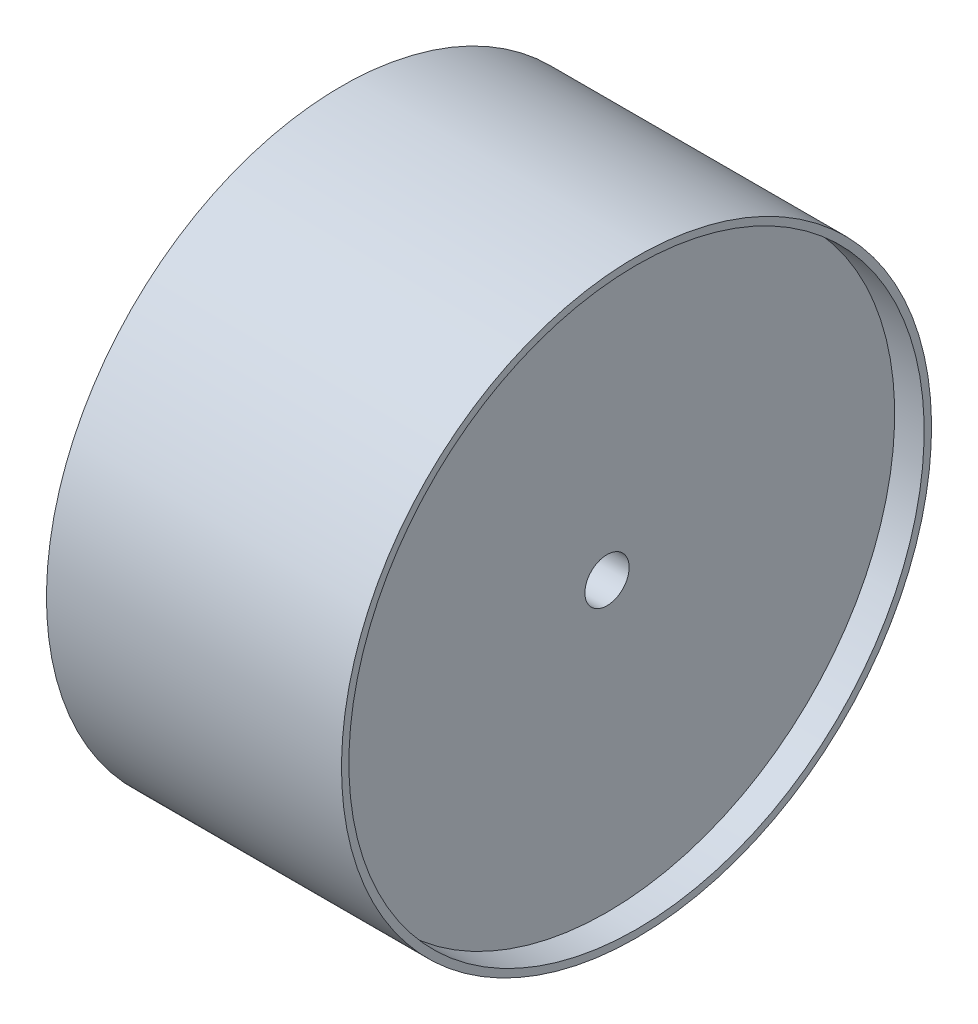
ISO-10303-21;
HEADER;
FILE_DESCRIPTION(('STEP AP214'),'2;1');
FILE_NAME('part.step','',(''),(''),'','','');
FILE_SCHEMA(('AUTOMOTIVE_DESIGN { 1 0 10303 214 1 1 1 1 }'));
ENDSEC;
DATA;
#1=APPLICATION_CONTEXT('core data for automotive mechanical design processes');
#2=APPLICATION_PROTOCOL_DEFINITION('international standard','automotive_design',2000,#1);
#3=PRODUCT_CONTEXT('',#1,'mechanical');
#4=PRODUCT('Part','Part','',(#3));
#5=PRODUCT_RELATED_PRODUCT_CATEGORY('part','',(#4));
#6=PRODUCT_DEFINITION_FORMATION('','',#4);
#7=PRODUCT_DEFINITION_CONTEXT('part definition',#1,'design');
#8=PRODUCT_DEFINITION('design','',#6,#7);
#9=PRODUCT_DEFINITION_SHAPE('','',#8);
#10=(LENGTH_UNIT() NAMED_UNIT(*) SI_UNIT(.MILLI.,.METRE.));
#11=(NAMED_UNIT(*) PLANE_ANGLE_UNIT() SI_UNIT($,.RADIAN.));
#12=(NAMED_UNIT(*) SI_UNIT($,.STERADIAN.) SOLID_ANGLE_UNIT());
#13=UNCERTAINTY_MEASURE_WITH_UNIT(LENGTH_MEASURE(1.E-05),#10,'distance_accuracy_value','');
#14=(GEOMETRIC_REPRESENTATION_CONTEXT(3) GLOBAL_UNCERTAINTY_ASSIGNED_CONTEXT((#13)) GLOBAL_UNIT_ASSIGNED_CONTEXT((#10,
#11,#12)) REPRESENTATION_CONTEXT('',''));
#15=CARTESIAN_POINT('',(0.,0.,0.));
#16=DIRECTION('',(0.,0.,1.));
#17=DIRECTION('',(1.,0.,0.));
#18=AXIS2_PLACEMENT_3D('',#15,#16,#17);
#19=CARTESIAN_POINT('',(40.,80.,0.));
#20=DIRECTION('',(-1.,0.,0.));
#21=DIRECTION('',(0.,-1.,0.));
#22=AXIS2_PLACEMENT_3D('',#19,#20,#21);
#23=PLANE('',#22);
#24=CARTESIAN_POINT('',(40.,-1.11022302462516E-13,-1.11022302462516E-13));
#25=DIRECTION('',(-1.,0.,0.));
#26=DIRECTION('',(0.,-1.,0.));
#27=AXIS2_PLACEMENT_3D('',#24,#25,#26);
#28=CIRCLE('',#27,80.);
#29=CARTESIAN_POINT('',(40.,-80.0000000000001,-1.15463194561016E-13));
#30=VERTEX_POINT('',#29);
#31=EDGE_CURVE('E87',#30,#30,#28,.T.);
#32=ORIENTED_EDGE('',*,*,#31,.F.);
#33=EDGE_LOOP('',(#32));
#34=FACE_BOUND('',#33,.T.);
#35=CARTESIAN_POINT('',(40.,-1.11022302462516E-13,-1.11022302462516E-13));
#36=DIRECTION('',(-1.,0.,0.));
#37=DIRECTION('',(0.,-1.,0.));
#38=AXIS2_PLACEMENT_3D('',#35,#36,#37);
#39=CIRCLE('',#38,78.);
#40=CARTESIAN_POINT('',(40.,-78.0000000000001,-1.15352172258554E-13));
#41=VERTEX_POINT('',#40);
#42=EDGE_CURVE('E66',#41,#41,#39,.T.);
#43=ORIENTED_EDGE('',*,*,#42,.T.);
#44=EDGE_LOOP('',(#43));
#45=FACE_BOUND('',#44,.T.);
#46=ADVANCED_FACE('F46',(#34,#45),#23,.F.);
#47=CARTESIAN_POINT('',(-118.179588976027,0.,0.));
#48=DIRECTION('',(-1.,0.,0.));
#49=DIRECTION('',(0.,-1.,0.));
#50=AXIS2_PLACEMENT_3D('',#47,#48,#49);
#51=CYLINDRICAL_SURFACE('',#50,78.);
#52=ORIENTED_EDGE('',*,*,#42,.F.);
#53=EDGE_LOOP('',(#52));
#54=FACE_BOUND('',#53,.T.);
#55=CARTESIAN_POINT('',(32.,-1.11022302462516E-13,-1.11022302462516E-13));
#56=DIRECTION('',(-1.,0.,0.));
#57=DIRECTION('',(0.,-1.,0.));
#58=AXIS2_PLACEMENT_3D('',#55,#56,#57);
#59=CIRCLE('',#58,78.);
#60=CARTESIAN_POINT('',(32.,-78.0000000000001,-1.15352172258554E-13));
#61=VERTEX_POINT('',#60);
#62=EDGE_CURVE('E69',#61,#61,#59,.T.);
#63=ORIENTED_EDGE('',*,*,#62,.T.);
#64=EDGE_LOOP('',(#63));
#65=FACE_BOUND('',#64,.T.);
#66=ADVANCED_FACE('F116',(#54,#65),#51,.F.);
#67=CARTESIAN_POINT('',(32.,77.9999999999998,-1.38777878078145E-13));
#68=DIRECTION('',(-1.,0.,0.));
#69=DIRECTION('',(0.,-1.,0.));
#70=AXIS2_PLACEMENT_3D('',#67,#68,#69);
#71=PLANE('',#70);
#72=ORIENTED_EDGE('',*,*,#62,.F.);
#73=EDGE_LOOP('',(#72));
#74=FACE_BOUND('',#73,.T.);
#75=CARTESIAN_POINT('',(32.,-1.11022302462516E-13,-1.11022302462516E-13));
#76=DIRECTION('',(-1.,0.,0.));
#77=DIRECTION('',(0.,-1.,0.));
#78=AXIS2_PLACEMENT_3D('',#75,#76,#77);
#79=CIRCLE('',#78,6.);
#80=CARTESIAN_POINT('',(32.,-6.00000000000011,-1.11355369369903E-13));
#81=VERTEX_POINT('',#80);
#82=EDGE_CURVE('E72',#81,#81,#79,.T.);
#83=ORIENTED_EDGE('',*,*,#82,.T.);
#84=EDGE_LOOP('',(#83));
#85=FACE_BOUND('',#84,.T.);
#86=ADVANCED_FACE('F122',(#74,#85),#71,.F.);
#87=CARTESIAN_POINT('',(-118.179588976027,0.,0.));
#88=DIRECTION('',(-1.,0.,0.));
#89=DIRECTION('',(0.,-1.,0.));
#90=AXIS2_PLACEMENT_3D('',#87,#88,#89);
#91=CYLINDRICAL_SURFACE('',#90,6.);
#92=ORIENTED_EDGE('',*,*,#82,.F.);
#93=EDGE_LOOP('',(#92));
#94=FACE_BOUND('',#93,.T.);
#95=CARTESIAN_POINT('',(-32.,-1.11022302462516E-13,0.));
#96=DIRECTION('',(-1.,0.,0.));
#97=DIRECTION('',(0.,-1.,0.));
#98=AXIS2_PLACEMENT_3D('',#95,#96,#97);
#99=CIRCLE('',#98,5.99999999999999);
#100=CARTESIAN_POINT('',(-32.,-6.0000000000001,0.));
#101=VERTEX_POINT('',#100);
#102=EDGE_CURVE('E75',#101,#101,#99,.T.);
#103=ORIENTED_EDGE('',*,*,#102,.T.);
#104=EDGE_LOOP('',(#103));
#105=FACE_BOUND('',#104,.T.);
#106=ADVANCED_FACE('F130',(#94,#105),#91,.F.);
#107=CARTESIAN_POINT('',(-32.,77.9999999999998,-1.11022302462516E-13));
#108=DIRECTION('',(1.,0.,0.));
#109=DIRECTION('',(0.,1.,0.));
#110=AXIS2_PLACEMENT_3D('',#107,#108,#109);
#111=PLANE('',#110);
#112=CARTESIAN_POINT('',(-32.,-49.9847883986185,-3.60822483003176E-13));
#113=DIRECTION('',(-1.,0.,0.));
#114=DIRECTION('',(0.,-1.,0.));
#115=AXIS2_PLACEMENT_3D('',#112,#113,#114);
#116=CIRCLE('',#115,7.5);
#117=CARTESIAN_POINT('',(-32.,-57.4847883986185,-3.6123881663741E-13));
#118=VERTEX_POINT('',#117);
#119=EDGE_CURVE('E90',#118,#118,#116,.T.);
#120=ORIENTED_EDGE('',*,*,#119,.F.);
#121=EDGE_LOOP('',(#120));
#122=FACE_BOUND('',#121,.T.);
#123=ORIENTED_EDGE('',*,*,#102,.F.);
#124=EDGE_LOOP('',(#123));
#125=FACE_BOUND('',#124,.T.);
#126=CARTESIAN_POINT('',(-32.,-1.11022302462516E-13,0.));
#127=DIRECTION('',(-1.,0.,0.));
#128=DIRECTION('',(0.,-1.,0.));
#129=AXIS2_PLACEMENT_3D('',#126,#127,#128);
#130=CIRCLE('',#129,78.);
#131=CARTESIAN_POINT('',(-32.,-78.0000000000001,0.));
#132=VERTEX_POINT('',#131);
#133=EDGE_CURVE('E78',#132,#132,#130,.T.);
#134=ORIENTED_EDGE('',*,*,#133,.T.);
#135=EDGE_LOOP('',(#134));
#136=FACE_BOUND('',#135,.T.);
#137=ADVANCED_FACE('F134',(#122,#125,#136),#111,.F.);
#138=CARTESIAN_POINT('',(-118.179588976027,0.,0.));
#139=DIRECTION('',(-1.,0.,0.));
#140=DIRECTION('',(0.,-1.,0.));
#141=AXIS2_PLACEMENT_3D('',#138,#139,#140);
#142=CYLINDRICAL_SURFACE('',#141,78.);
#143=ORIENTED_EDGE('',*,*,#133,.F.);
#144=EDGE_LOOP('',(#143));
#145=FACE_BOUND('',#144,.T.);
#146=CARTESIAN_POINT('',(-40.,-1.11022302462516E-13,0.));
#147=DIRECTION('',(-1.,0.,0.));
#148=DIRECTION('',(0.,-1.,0.));
#149=AXIS2_PLACEMENT_3D('',#146,#147,#148);
#150=CIRCLE('',#149,78.);
#151=CARTESIAN_POINT('',(-40.,-78.0000000000001,0.));
#152=VERTEX_POINT('',#151);
#153=EDGE_CURVE('E81',#152,#152,#150,.T.);
#154=ORIENTED_EDGE('',*,*,#153,.T.);
#155=EDGE_LOOP('',(#154));
#156=FACE_BOUND('',#155,.T.);
#157=ADVANCED_FACE('F138',(#145,#156),#142,.F.);
#158=CARTESIAN_POINT('',(-40.,80.,0.));
#159=DIRECTION('',(1.,0.,0.));
#160=DIRECTION('',(0.,1.,0.));
#161=AXIS2_PLACEMENT_3D('',#158,#159,#160);
#162=PLANE('',#161);
#163=ORIENTED_EDGE('',*,*,#153,.F.);
#164=EDGE_LOOP('',(#163));
#165=FACE_BOUND('',#164,.T.);
#166=CARTESIAN_POINT('',(-40.,-1.11022302462516E-13,0.));
#167=DIRECTION('',(-1.,0.,0.));
#168=DIRECTION('',(0.,-1.,0.));
#169=AXIS2_PLACEMENT_3D('',#166,#167,#168);
#170=CIRCLE('',#169,80.);
#171=CARTESIAN_POINT('',(-40.,-80.0000000000001,0.));
#172=VERTEX_POINT('',#171);
#173=EDGE_CURVE('E84',#172,#172,#170,.T.);
#174=ORIENTED_EDGE('',*,*,#173,.T.);
#175=EDGE_LOOP('',(#174));
#176=FACE_BOUND('',#175,.T.);
#177=ADVANCED_FACE('F142',(#165,#176),#162,.F.);
#178=CARTESIAN_POINT('',(-118.179588976027,0.,0.));
#179=DIRECTION('',(-1.,0.,0.));
#180=DIRECTION('',(0.,-1.,0.));
#181=AXIS2_PLACEMENT_3D('',#178,#179,#180);
#182=CYLINDRICAL_SURFACE('',#181,80.);
#183=ORIENTED_EDGE('',*,*,#173,.F.);
#184=EDGE_LOOP('',(#183));
#185=FACE_BOUND('',#184,.T.);
#186=ORIENTED_EDGE('',*,*,#31,.T.);
#187=EDGE_LOOP('',(#186));
#188=FACE_BOUND('',#187,.T.);
#189=ADVANCED_FACE('F146',(#185,#188),#182,.T.);
#190=CARTESIAN_POINT('',(-15.,-49.9847883986185,-3.60822483003176E-13));
#191=DIRECTION('',(-1.,0.,0.));
#192=DIRECTION('',(0.,-1.,0.));
#193=AXIS2_PLACEMENT_3D('',#190,#191,#192);
#194=CYLINDRICAL_SURFACE('',#193,7.5);
#195=CARTESIAN_POINT('',(-30.,-49.9847883986185,-3.60822483003176E-13));
#196=DIRECTION('',(1.,0.,0.));
#197=DIRECTION('',(0.,1.,0.));
#198=AXIS2_PLACEMENT_3D('',#195,#196,#197);
#199=CIRCLE('',#198,7.5);
#200=CARTESIAN_POINT('',(-30.,-42.4847883986185,-3.60406149368941E-13));
#201=VERTEX_POINT('',#200);
#202=EDGE_CURVE('E50',#201,#201,#199,.T.);
#203=ORIENTED_EDGE('',*,*,#202,.T.);
#204=EDGE_LOOP('',(#203));
#205=FACE_BOUND('',#204,.T.);
#206=ORIENTED_EDGE('',*,*,#119,.T.);
#207=EDGE_LOOP('',(#206));
#208=FACE_BOUND('',#207,.T.);
#209=ADVANCED_FACE('F97',(#205,#208),#194,.F.);
#210=CARTESIAN_POINT('',(-118.179588976027,0.,0.));
#211=DIRECTION('',(-1.,0.,0.));
#212=DIRECTION('',(0.,-1.,0.));
#213=AXIS2_PLACEMENT_3D('',#210,#211,#212);
#214=CYLINDRICAL_SURFACE('',#213,78.);
#215=CARTESIAN_POINT('',(-30.,-1.11022302462516E-13,0.));
#216=DIRECTION('',(-1.,0.,0.));
#217=DIRECTION('',(0.,-1.,0.));
#218=AXIS2_PLACEMENT_3D('',#215,#216,#217);
#219=CIRCLE('',#218,78.);
#220=CARTESIAN_POINT('',(-30.,-78.0000000000001,0.));
#221=VERTEX_POINT('',#220);
#222=EDGE_CURVE('E12',#221,#221,#219,.T.);
#223=ORIENTED_EDGE('',*,*,#222,.T.);
#224=EDGE_LOOP('',(#223));
#225=FACE_BOUND('',#224,.T.);
#226=CARTESIAN_POINT('',(30.,-1.11022302462516E-13,-1.11022302462516E-13));
#227=DIRECTION('',(-1.,0.,0.));
#228=DIRECTION('',(0.,-1.,0.));
#229=AXIS2_PLACEMENT_3D('',#226,#227,#228);
#230=CIRCLE('',#229,78.);
#231=CARTESIAN_POINT('',(30.,-78.0000000000001,-1.15352172258554E-13));
#232=VERTEX_POINT('',#231);
#233=EDGE_CURVE('E63',#232,#232,#230,.T.);
#234=ORIENTED_EDGE('',*,*,#233,.F.);
#235=EDGE_LOOP('',(#234));
#236=FACE_BOUND('',#235,.T.);
#237=ADVANCED_FACE('F48',(#225,#236),#214,.F.);
#238=CARTESIAN_POINT('',(-29.9999999999999,8.00000000000001,-1.11022302462516E-13));
#239=DIRECTION('',(1.,0.,0.));
#240=DIRECTION('',(0.,1.,0.));
#241=AXIS2_PLACEMENT_3D('',#238,#239,#240);
#242=PLANE('',#241);
#243=ORIENTED_EDGE('',*,*,#202,.F.);
#244=EDGE_LOOP('',(#243));
#245=FACE_BOUND('',#244,.T.);
#246=CARTESIAN_POINT('',(-30.,-1.11022302462516E-13,0.));
#247=DIRECTION('',(-1.,0.,0.));
#248=DIRECTION('',(0.,-1.,0.));
#249=AXIS2_PLACEMENT_3D('',#246,#247,#248);
#250=CIRCLE('',#249,7.99999999999999);
#251=CARTESIAN_POINT('',(-30.,-8.0000000000001,0.));
#252=VERTEX_POINT('',#251);
#253=EDGE_CURVE('E54',#252,#252,#250,.T.);
#254=ORIENTED_EDGE('',*,*,#253,.T.);
#255=EDGE_LOOP('',(#254));
#256=FACE_BOUND('',#255,.T.);
#257=ORIENTED_EDGE('',*,*,#222,.F.);
#258=EDGE_LOOP('',(#257));
#259=FACE_BOUND('',#258,.T.);
#260=ADVANCED_FACE('F99',(#245,#256,#259),#242,.T.);
#261=CARTESIAN_POINT('',(-118.179588976027,0.,0.));
#262=DIRECTION('',(-1.,0.,0.));
#263=DIRECTION('',(0.,-1.,0.));
#264=AXIS2_PLACEMENT_3D('',#261,#262,#263);
#265=CYLINDRICAL_SURFACE('',#264,8.);
#266=CARTESIAN_POINT('',(30.,-1.11022302462516E-13,-1.11022302462516E-13));
#267=DIRECTION('',(-1.,0.,0.));
#268=DIRECTION('',(0.,-1.,0.));
#269=AXIS2_PLACEMENT_3D('',#266,#267,#268);
#270=CIRCLE('',#269,8.);
#271=CARTESIAN_POINT('',(30.,-8.00000000000011,-1.11466391672366E-13));
#272=VERTEX_POINT('',#271);
#273=EDGE_CURVE('E58',#272,#272,#270,.T.);
#274=ORIENTED_EDGE('',*,*,#273,.T.);
#275=EDGE_LOOP('',(#274));
#276=FACE_BOUND('',#275,.T.);
#277=ORIENTED_EDGE('',*,*,#253,.F.);
#278=EDGE_LOOP('',(#277));
#279=FACE_BOUND('',#278,.T.);
#280=ADVANCED_FACE('F102',(#276,#279),#265,.T.);
#281=CARTESIAN_POINT('',(30.,8.00000000000001,-1.11022302462516E-13));
#282=DIRECTION('',(-1.,0.,0.));
#283=DIRECTION('',(0.,-1.,0.));
#284=AXIS2_PLACEMENT_3D('',#281,#282,#283);
#285=PLANE('',#284);
#286=ORIENTED_EDGE('',*,*,#233,.T.);
#287=EDGE_LOOP('',(#286));
#288=FACE_BOUND('',#287,.T.);
#289=ORIENTED_EDGE('',*,*,#273,.F.);
#290=EDGE_LOOP('',(#289));
#291=FACE_BOUND('',#290,.T.);
#292=ADVANCED_FACE('F107',(#288,#291),#285,.T.);
#293=CLOSED_SHELL('',(#46,#66,#86,#106,#137,#157,#177,#189,#209,#237,#260,#280,#292));
#294=MANIFOLD_SOLID_BREP('B2',#293);
#295=ADVANCED_BREP_SHAPE_REPRESENTATION('',(#18,#294),#14);
#296=SHAPE_DEFINITION_REPRESENTATION(#9,#295);
ENDSEC;
END-ISO-10303-21;
